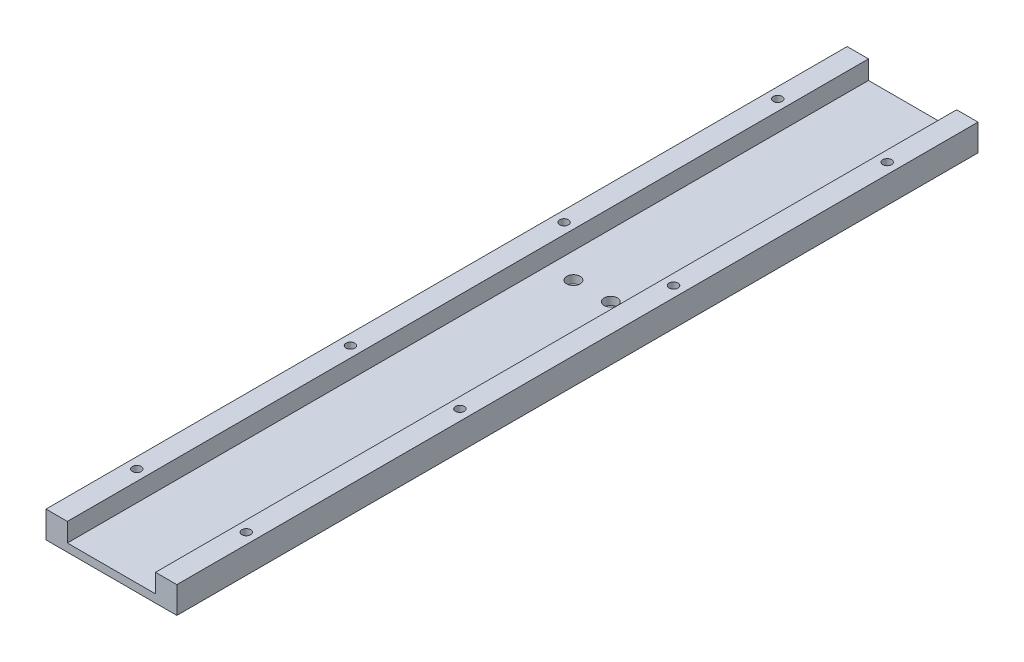
ISO-10303-21;
HEADER;
FILE_DESCRIPTION(('STEP AP214'),'2;1');
FILE_NAME('part.step','',(''),(''),'','','');
FILE_SCHEMA(('AUTOMOTIVE_DESIGN { 1 0 10303 214 1 1 1 1 }'));
ENDSEC;
DATA;
#1=APPLICATION_CONTEXT('core data for automotive mechanical design processes');
#2=APPLICATION_PROTOCOL_DEFINITION('international standard','automotive_design',2000,#1);
#3=PRODUCT_CONTEXT('',#1,'mechanical');
#4=PRODUCT('Part','Part','',(#3));
#5=PRODUCT_RELATED_PRODUCT_CATEGORY('part','',(#4));
#6=PRODUCT_DEFINITION_FORMATION('','',#4);
#7=PRODUCT_DEFINITION_CONTEXT('part definition',#1,'design');
#8=PRODUCT_DEFINITION('design','',#6,#7);
#9=PRODUCT_DEFINITION_SHAPE('','',#8);
#10=(LENGTH_UNIT() NAMED_UNIT(*) SI_UNIT(.MILLI.,.METRE.));
#11=(NAMED_UNIT(*) PLANE_ANGLE_UNIT() SI_UNIT($,.RADIAN.));
#12=(NAMED_UNIT(*) SI_UNIT($,.STERADIAN.) SOLID_ANGLE_UNIT());
#13=UNCERTAINTY_MEASURE_WITH_UNIT(LENGTH_MEASURE(1.E-05),#10,'distance_accuracy_value','');
#14=(GEOMETRIC_REPRESENTATION_CONTEXT(3) GLOBAL_UNCERTAINTY_ASSIGNED_CONTEXT((#13)) GLOBAL_UNIT_ASSIGNED_CONTEXT((#10,
#11,#12)) REPRESENTATION_CONTEXT('',''));
#15=CARTESIAN_POINT('',(0.,0.,0.));
#16=DIRECTION('',(0.,0.,1.));
#17=DIRECTION('',(1.,0.,0.));
#18=AXIS2_PLACEMENT_3D('',#15,#16,#17);
#19=CARTESIAN_POINT('',(0.,0.,300.));
#20=DIRECTION('',(0.,1.,0.));
#21=DIRECTION('',(0.,0.,1.));
#22=AXIS2_PLACEMENT_3D('',#19,#20,#21);
#23=PLANE('',#22);
#24=CARTESIAN_POINT('',(45.,0.,190.));
#25=DIRECTION('',(0.,1.,0.));
#26=DIRECTION('',(0.,0.,1.));
#27=AXIS2_PLACEMENT_3D('',#24,#25,#26);
#28=CIRCLE('',#27,1.65000000000001);
#29=CARTESIAN_POINT('',(45.,0.,191.65));
#30=VERTEX_POINT('',#29);
#31=EDGE_CURVE('E173',#30,#30,#28,.T.);
#32=ORIENTED_EDGE('',*,*,#31,.T.);
#33=EDGE_LOOP('',(#32));
#34=FACE_BOUND('',#33,.T.);
#35=CARTESIAN_POINT('',(45.,0.,110.));
#36=DIRECTION('',(0.,1.,0.));
#37=DIRECTION('',(0.,0.,-1.));
#38=AXIS2_PLACEMENT_3D('',#35,#36,#37);
#39=CIRCLE('',#38,1.65);
#40=CARTESIAN_POINT('',(45.,0.,108.35));
#41=VERTEX_POINT('',#40);
#42=EDGE_CURVE('E249',#41,#41,#39,.T.);
#43=ORIENTED_EDGE('',*,*,#42,.T.);
#44=EDGE_LOOP('',(#43));
#45=FACE_BOUND('',#44,.T.);
#46=CARTESIAN_POINT('',(44.9999999999999,0.,30.));
#47=DIRECTION('',(0.,1.,0.));
#48=DIRECTION('',(0.,0.,-1.));
#49=AXIS2_PLACEMENT_3D('',#46,#47,#48);
#50=CIRCLE('',#49,1.65);
#51=CARTESIAN_POINT('',(44.9999999999999,0.,28.35));
#52=VERTEX_POINT('',#51);
#53=EDGE_CURVE('E253',#52,#52,#50,.T.);
#54=ORIENTED_EDGE('',*,*,#53,.T.);
#55=EDGE_LOOP('',(#54));
#56=FACE_BOUND('',#55,.T.);
#57=CARTESIAN_POINT('',(3.99999999999993,0.,30.));
#58=DIRECTION('',(0.,1.,0.));
#59=DIRECTION('',(0.,0.,1.));
#60=AXIS2_PLACEMENT_3D('',#57,#58,#59);
#61=CIRCLE('',#60,1.65);
#62=CARTESIAN_POINT('',(3.99999999999993,0.,31.65));
#63=VERTEX_POINT('',#62);
#64=EDGE_CURVE('E257',#63,#63,#61,.T.);
#65=ORIENTED_EDGE('',*,*,#64,.T.);
#66=EDGE_LOOP('',(#65));
#67=FACE_BOUND('',#66,.T.);
#68=CARTESIAN_POINT('',(3.99999999999998,0.,110.));
#69=DIRECTION('',(0.,1.,0.));
#70=DIRECTION('',(0.,0.,1.));
#71=AXIS2_PLACEMENT_3D('',#68,#69,#70);
#72=CIRCLE('',#71,1.65);
#73=CARTESIAN_POINT('',(3.99999999999998,0.,111.65));
#74=VERTEX_POINT('',#73);
#75=EDGE_CURVE('E261',#74,#74,#72,.T.);
#76=ORIENTED_EDGE('',*,*,#75,.T.);
#77=EDGE_LOOP('',(#76));
#78=FACE_BOUND('',#77,.T.);
#79=CARTESIAN_POINT('',(4.,0.,190.));
#80=DIRECTION('',(0.,1.,0.));
#81=DIRECTION('',(0.,0.,-1.));
#82=AXIS2_PLACEMENT_3D('',#79,#80,#81);
#83=CIRCLE('',#82,1.65);
#84=CARTESIAN_POINT('',(4.,0.,188.35));
#85=VERTEX_POINT('',#84);
#86=EDGE_CURVE('E265',#85,#85,#83,.T.);
#87=ORIENTED_EDGE('',*,*,#86,.T.);
#88=EDGE_LOOP('',(#87));
#89=FACE_BOUND('',#88,.T.);
#90=CARTESIAN_POINT('',(4.,0.,270.));
#91=DIRECTION('',(0.,1.,0.));
#92=DIRECTION('',(0.,0.,-1.));
#93=AXIS2_PLACEMENT_3D('',#90,#91,#92);
#94=CIRCLE('',#93,1.65);
#95=CARTESIAN_POINT('',(4.,0.,268.35));
#96=VERTEX_POINT('',#95);
#97=EDGE_CURVE('E197',#96,#96,#94,.T.);
#98=ORIENTED_EDGE('',*,*,#97,.T.);
#99=EDGE_LOOP('',(#98));
#100=FACE_BOUND('',#99,.T.);
#101=CARTESIAN_POINT('',(45.,0.,270.));
#102=DIRECTION('',(0.,1.,0.));
#103=DIRECTION('',(0.,0.,1.));
#104=AXIS2_PLACEMENT_3D('',#101,#102,#103);
#105=CIRCLE('',#104,1.65000000000001);
#106=CARTESIAN_POINT('',(45.,0.,271.65));
#107=VERTEX_POINT('',#106);
#108=EDGE_CURVE('E168',#107,#107,#105,.T.);
#109=ORIENTED_EDGE('',*,*,#108,.T.);
#110=EDGE_LOOP('',(#109));
#111=FACE_BOUND('',#110,.T.);
#112=CARTESIAN_POINT('',(31.5,0.,120.));
#113=DIRECTION('',(0.,1.,0.));
#114=DIRECTION('',(0.,0.,-1.));
#115=AXIS2_PLACEMENT_3D('',#112,#113,#114);
#116=CIRCLE('',#115,2.5);
#117=CARTESIAN_POINT('',(31.5,0.,117.5));
#118=VERTEX_POINT('',#117);
#119=EDGE_CURVE('E164',#118,#118,#116,.T.);
#120=ORIENTED_EDGE('',*,*,#119,.T.);
#121=EDGE_LOOP('',(#120));
#122=FACE_BOUND('',#121,.T.);
#123=CARTESIAN_POINT('',(17.5,0.,120.));
#124=DIRECTION('',(0.,1.,0.));
#125=DIRECTION('',(0.,0.,1.));
#126=AXIS2_PLACEMENT_3D('',#123,#124,#125);
#127=CIRCLE('',#126,2.5);
#128=CARTESIAN_POINT('',(17.5,0.,122.5));
#129=VERTEX_POINT('',#128);
#130=EDGE_CURVE('E160',#129,#129,#127,.T.);
#131=ORIENTED_EDGE('',*,*,#130,.T.);
#132=EDGE_LOOP('',(#131));
#133=FACE_BOUND('',#132,.T.);
#134=DIRECTION('',(1.,0.,0.));
#135=VECTOR('',#134,1.);
#136=CARTESIAN_POINT('',(0.,0.,0.));
#137=LINE('',#136,#135);
#138=CARTESIAN_POINT('',(0.,0.,0.));
#139=VERTEX_POINT('',#138);
#140=CARTESIAN_POINT('',(49.,0.,0.));
#141=VERTEX_POINT('',#140);
#142=EDGE_CURVE('E131',#139,#141,#137,.T.);
#143=ORIENTED_EDGE('',*,*,#142,.T.);
#144=DIRECTION('',(0.,0.,-1.));
#145=VECTOR('',#144,1.);
#146=CARTESIAN_POINT('',(49.,0.,300.));
#147=LINE('',#146,#145);
#148=CARTESIAN_POINT('',(49.,0.,300.));
#149=VERTEX_POINT('',#148);
#150=EDGE_CURVE('E11',#149,#141,#147,.T.);
#151=ORIENTED_EDGE('',*,*,#150,.F.);
#152=DIRECTION('',(1.,0.,0.));
#153=VECTOR('',#152,1.);
#154=CARTESIAN_POINT('',(0.,0.,300.));
#155=LINE('',#154,#153);
#156=CARTESIAN_POINT('',(0.,0.,300.));
#157=VERTEX_POINT('',#156);
#158=EDGE_CURVE('E146',#157,#149,#155,.T.);
#159=ORIENTED_EDGE('',*,*,#158,.F.);
#160=DIRECTION('',(0.,0.,-1.));
#161=VECTOR('',#160,1.);
#162=CARTESIAN_POINT('',(0.,0.,300.));
#163=LINE('',#162,#161);
#164=EDGE_CURVE('E127',#157,#139,#163,.T.);
#165=ORIENTED_EDGE('',*,*,#164,.T.);
#166=EDGE_LOOP('',(#143,#151,#159,#165));
#167=FACE_BOUND('',#166,.T.);
#168=ADVANCED_FACE('F33',(#34,#45,#56,#67,#78,#89,#100,#111,#122,#133,#167),#23,.F.);
#169=CARTESIAN_POINT('',(49.,0.,300.));
#170=DIRECTION('',(-1.,0.,0.));
#171=DIRECTION('',(0.,0.,1.));
#172=AXIS2_PLACEMENT_3D('',#169,#170,#171);
#173=PLANE('',#172);
#174=DIRECTION('',(0.,1.,0.));
#175=VECTOR('',#174,1.);
#176=CARTESIAN_POINT('',(49.,0.,0.));
#177=LINE('',#176,#175);
#178=CARTESIAN_POINT('',(49.,10.,0.));
#179=VERTEX_POINT('',#178);
#180=EDGE_CURVE('E134',#141,#179,#177,.T.);
#181=ORIENTED_EDGE('',*,*,#180,.T.);
#182=DIRECTION('',(0.,0.,-1.));
#183=VECTOR('',#182,1.);
#184=CARTESIAN_POINT('',(49.,10.,300.));
#185=LINE('',#184,#183);
#186=CARTESIAN_POINT('',(49.,10.,300.));
#187=VERTEX_POINT('',#186);
#188=EDGE_CURVE('E42',#187,#179,#185,.T.);
#189=ORIENTED_EDGE('',*,*,#188,.F.);
#190=DIRECTION('',(0.,1.,0.));
#191=VECTOR('',#190,1.);
#192=CARTESIAN_POINT('',(49.,0.,300.));
#193=LINE('',#192,#191);
#194=EDGE_CURVE('E94',#149,#187,#193,.T.);
#195=ORIENTED_EDGE('',*,*,#194,.F.);
#196=ORIENTED_EDGE('',*,*,#150,.T.);
#197=EDGE_LOOP('',(#181,#189,#195,#196));
#198=FACE_BOUND('',#197,.T.);
#199=ADVANCED_FACE('F237',(#198),#173,.F.);
#200=CARTESIAN_POINT('',(49.,10.,300.));
#201=DIRECTION('',(0.,-1.,0.));
#202=DIRECTION('',(0.,0.,-1.));
#203=AXIS2_PLACEMENT_3D('',#200,#201,#202);
#204=PLANE('',#203);
#205=CARTESIAN_POINT('',(45.,10.,190.));
#206=DIRECTION('',(0.,-1.,0.));
#207=DIRECTION('',(0.,0.,-1.));
#208=AXIS2_PLACEMENT_3D('',#205,#206,#207);
#209=CIRCLE('',#208,1.65000000000001);
#210=CARTESIAN_POINT('',(45.,10.,188.35));
#211=VERTEX_POINT('',#210);
#212=EDGE_CURVE('E36',#211,#211,#209,.T.);
#213=ORIENTED_EDGE('',*,*,#212,.T.);
#214=EDGE_LOOP('',(#213));
#215=FACE_BOUND('',#214,.T.);
#216=CARTESIAN_POINT('',(45.,10.,110.));
#217=DIRECTION('',(0.,-1.,0.));
#218=DIRECTION('',(0.,0.,-1.));
#219=AXIS2_PLACEMENT_3D('',#216,#217,#218);
#220=CIRCLE('',#219,1.65);
#221=CARTESIAN_POINT('',(45.,10.,108.35));
#222=VERTEX_POINT('',#221);
#223=EDGE_CURVE('E184',#222,#222,#220,.T.);
#224=ORIENTED_EDGE('',*,*,#223,.T.);
#225=EDGE_LOOP('',(#224));
#226=FACE_BOUND('',#225,.T.);
#227=CARTESIAN_POINT('',(44.9999999999999,10.,30.));
#228=DIRECTION('',(0.,-1.,0.));
#229=DIRECTION('',(0.,0.,-1.));
#230=AXIS2_PLACEMENT_3D('',#227,#228,#229);
#231=CIRCLE('',#230,1.65);
#232=CARTESIAN_POINT('',(44.9999999999999,10.,28.35));
#233=VERTEX_POINT('',#232);
#234=EDGE_CURVE('E182',#233,#233,#231,.T.);
#235=ORIENTED_EDGE('',*,*,#234,.T.);
#236=EDGE_LOOP('',(#235));
#237=FACE_BOUND('',#236,.T.);
#238=CARTESIAN_POINT('',(45.,10.,270.));
#239=DIRECTION('',(0.,-1.,0.));
#240=DIRECTION('',(0.,0.,-1.));
#241=AXIS2_PLACEMENT_3D('',#238,#239,#240);
#242=CIRCLE('',#241,1.65000000000001);
#243=CARTESIAN_POINT('',(45.,10.,268.35));
#244=VERTEX_POINT('',#243);
#245=EDGE_CURVE('E165',#244,#244,#242,.T.);
#246=ORIENTED_EDGE('',*,*,#245,.T.);
#247=EDGE_LOOP('',(#246));
#248=FACE_BOUND('',#247,.T.);
#249=DIRECTION('',(-1.,0.,0.));
#250=VECTOR('',#249,1.);
#251=CARTESIAN_POINT('',(49.,10.,0.));
#252=LINE('',#251,#250);
#253=CARTESIAN_POINT('',(41.,10.,0.));
#254=VERTEX_POINT('',#253);
#255=EDGE_CURVE('E137',#179,#254,#252,.T.);
#256=ORIENTED_EDGE('',*,*,#255,.T.);
#257=DIRECTION('',(0.,0.,-1.));
#258=VECTOR('',#257,1.);
#259=CARTESIAN_POINT('',(41.,10.,300.));
#260=LINE('',#259,#258);
#261=CARTESIAN_POINT('',(41.,10.,300.));
#262=VERTEX_POINT('',#261);
#263=EDGE_CURVE('E153',#262,#254,#260,.T.);
#264=ORIENTED_EDGE('',*,*,#263,.F.);
#265=DIRECTION('',(-1.,0.,0.));
#266=VECTOR('',#265,1.);
#267=CARTESIAN_POINT('',(49.,10.,300.));
#268=LINE('',#267,#266);
#269=EDGE_CURVE('E205',#187,#262,#268,.T.);
#270=ORIENTED_EDGE('',*,*,#269,.F.);
#271=ORIENTED_EDGE('',*,*,#188,.T.);
#272=EDGE_LOOP('',(#256,#264,#270,#271));
#273=FACE_BOUND('',#272,.T.);
#274=ADVANCED_FACE('F242',(#215,#226,#237,#248,#273),#204,.F.);
#275=CARTESIAN_POINT('',(41.,10.,300.));
#276=DIRECTION('',(1.,0.,0.));
#277=DIRECTION('',(0.,0.,-1.));
#278=AXIS2_PLACEMENT_3D('',#275,#276,#277);
#279=PLANE('',#278);
#280=DIRECTION('',(0.,-1.,0.));
#281=VECTOR('',#280,1.);
#282=CARTESIAN_POINT('',(41.,10.,0.));
#283=LINE('',#282,#281);
#284=CARTESIAN_POINT('',(41.,3.,0.));
#285=VERTEX_POINT('',#284);
#286=EDGE_CURVE('E139',#254,#285,#283,.T.);
#287=ORIENTED_EDGE('',*,*,#286,.T.);
#288=DIRECTION('',(0.,0.,-1.));
#289=VECTOR('',#288,1.);
#290=CARTESIAN_POINT('',(41.,3.,300.));
#291=LINE('',#290,#289);
#292=CARTESIAN_POINT('',(41.,3.,300.));
#293=VERTEX_POINT('',#292);
#294=EDGE_CURVE('E150',#293,#285,#291,.T.);
#295=ORIENTED_EDGE('',*,*,#294,.F.);
#296=DIRECTION('',(0.,-1.,0.));
#297=VECTOR('',#296,1.);
#298=CARTESIAN_POINT('',(41.,10.,300.));
#299=LINE('',#298,#297);
#300=EDGE_CURVE('E207',#262,#293,#299,.T.);
#301=ORIENTED_EDGE('',*,*,#300,.F.);
#302=ORIENTED_EDGE('',*,*,#263,.T.);
#303=EDGE_LOOP('',(#287,#295,#301,#302));
#304=FACE_BOUND('',#303,.T.);
#305=ADVANCED_FACE('F213',(#304),#279,.F.);
#306=CARTESIAN_POINT('',(8.,3.,300.));
#307=DIRECTION('',(0.,-1.,0.));
#308=DIRECTION('',(0.,0.,-1.));
#309=AXIS2_PLACEMENT_3D('',#306,#307,#308);
#310=PLANE('',#309);
#311=CARTESIAN_POINT('',(31.5,3.,120.));
#312=DIRECTION('',(0.,-1.,0.));
#313=DIRECTION('',(0.,0.,-1.));
#314=AXIS2_PLACEMENT_3D('',#311,#312,#313);
#315=CIRCLE('',#314,2.5);
#316=CARTESIAN_POINT('',(31.5,3.,117.5));
#317=VERTEX_POINT('',#316);
#318=EDGE_CURVE('E161',#317,#317,#315,.T.);
#319=ORIENTED_EDGE('',*,*,#318,.T.);
#320=EDGE_LOOP('',(#319));
#321=FACE_BOUND('',#320,.T.);
#322=CARTESIAN_POINT('',(17.5,3.,120.));
#323=DIRECTION('',(0.,-1.,0.));
#324=DIRECTION('',(0.,0.,-1.));
#325=AXIS2_PLACEMENT_3D('',#322,#323,#324);
#326=CIRCLE('',#325,2.5);
#327=CARTESIAN_POINT('',(17.5,3.,117.5));
#328=VERTEX_POINT('',#327);
#329=EDGE_CURVE('E135',#328,#328,#326,.T.);
#330=ORIENTED_EDGE('',*,*,#329,.T.);
#331=EDGE_LOOP('',(#330));
#332=FACE_BOUND('',#331,.T.);
#333=DIRECTION('',(-1.,0.,0.));
#334=VECTOR('',#333,1.);
#335=CARTESIAN_POINT('',(8.,3.,0.));
#336=LINE('',#335,#334);
#337=CARTESIAN_POINT('',(8.,3.,0.));
#338=VERTEX_POINT('',#337);
#339=EDGE_CURVE('E141',#285,#338,#336,.T.);
#340=ORIENTED_EDGE('',*,*,#339,.T.);
#341=DIRECTION('',(0.,0.,-1.));
#342=VECTOR('',#341,1.);
#343=CARTESIAN_POINT('',(8.,3.,300.));
#344=LINE('',#343,#342);
#345=CARTESIAN_POINT('',(8.,3.,300.));
#346=VERTEX_POINT('',#345);
#347=EDGE_CURVE('E122',#346,#338,#344,.T.);
#348=ORIENTED_EDGE('',*,*,#347,.F.);
#349=DIRECTION('',(-1.,0.,0.));
#350=VECTOR('',#349,1.);
#351=CARTESIAN_POINT('',(8.,3.,300.));
#352=LINE('',#351,#350);
#353=EDGE_CURVE('E113',#293,#346,#352,.T.);
#354=ORIENTED_EDGE('',*,*,#353,.F.);
#355=ORIENTED_EDGE('',*,*,#294,.T.);
#356=EDGE_LOOP('',(#340,#348,#354,#355));
#357=FACE_BOUND('',#356,.T.);
#358=ADVANCED_FACE('F217',(#321,#332,#357),#310,.F.);
#359=CARTESIAN_POINT('',(8.,10.,300.));
#360=DIRECTION('',(-1.,0.,0.));
#361=DIRECTION('',(0.,0.,1.));
#362=AXIS2_PLACEMENT_3D('',#359,#360,#361);
#363=PLANE('',#362);
#364=DIRECTION('',(0.,1.,0.));
#365=VECTOR('',#364,1.);
#366=CARTESIAN_POINT('',(8.,10.,0.));
#367=LINE('',#366,#365);
#368=CARTESIAN_POINT('',(8.,10.,0.));
#369=VERTEX_POINT('',#368);
#370=EDGE_CURVE('E121',#338,#369,#367,.T.);
#371=ORIENTED_EDGE('',*,*,#370,.T.);
#372=DIRECTION('',(0.,0.,-1.));
#373=VECTOR('',#372,1.);
#374=CARTESIAN_POINT('',(8.,10.,300.));
#375=LINE('',#374,#373);
#376=CARTESIAN_POINT('',(8.,10.,300.));
#377=VERTEX_POINT('',#376);
#378=EDGE_CURVE('E118',#377,#369,#375,.T.);
#379=ORIENTED_EDGE('',*,*,#378,.F.);
#380=DIRECTION('',(0.,1.,0.));
#381=VECTOR('',#380,1.);
#382=CARTESIAN_POINT('',(8.,10.,300.));
#383=LINE('',#382,#381);
#384=EDGE_CURVE('E107',#346,#377,#383,.T.);
#385=ORIENTED_EDGE('',*,*,#384,.F.);
#386=ORIENTED_EDGE('',*,*,#347,.T.);
#387=EDGE_LOOP('',(#371,#379,#385,#386));
#388=FACE_BOUND('',#387,.T.);
#389=ADVANCED_FACE('F119',(#388),#363,.F.);
#390=CARTESIAN_POINT('',(0.,10.,300.));
#391=DIRECTION('',(0.,-1.,0.));
#392=DIRECTION('',(0.,0.,-1.));
#393=AXIS2_PLACEMENT_3D('',#390,#391,#392);
#394=PLANE('',#393);
#395=CARTESIAN_POINT('',(3.99999999999993,10.,30.));
#396=DIRECTION('',(0.,-1.,0.));
#397=DIRECTION('',(0.,0.,-1.));
#398=AXIS2_PLACEMENT_3D('',#395,#396,#397);
#399=CIRCLE('',#398,1.65);
#400=CARTESIAN_POINT('',(3.99999999999993,10.,28.35));
#401=VERTEX_POINT('',#400);
#402=EDGE_CURVE('E179',#401,#401,#399,.T.);
#403=ORIENTED_EDGE('',*,*,#402,.T.);
#404=EDGE_LOOP('',(#403));
#405=FACE_BOUND('',#404,.T.);
#406=CARTESIAN_POINT('',(3.99999999999998,10.,110.));
#407=DIRECTION('',(0.,-1.,0.));
#408=DIRECTION('',(0.,0.,-1.));
#409=AXIS2_PLACEMENT_3D('',#406,#407,#408);
#410=CIRCLE('',#409,1.65);
#411=CARTESIAN_POINT('',(3.99999999999998,10.,108.35));
#412=VERTEX_POINT('',#411);
#413=EDGE_CURVE('E176',#412,#412,#410,.T.);
#414=ORIENTED_EDGE('',*,*,#413,.T.);
#415=EDGE_LOOP('',(#414));
#416=FACE_BOUND('',#415,.T.);
#417=CARTESIAN_POINT('',(4.,10.,190.));
#418=DIRECTION('',(0.,-1.,0.));
#419=DIRECTION('',(0.,0.,-1.));
#420=AXIS2_PLACEMENT_3D('',#417,#418,#419);
#421=CIRCLE('',#420,1.65);
#422=CARTESIAN_POINT('',(4.,10.,188.35));
#423=VERTEX_POINT('',#422);
#424=EDGE_CURVE('E172',#423,#423,#421,.T.);
#425=ORIENTED_EDGE('',*,*,#424,.T.);
#426=EDGE_LOOP('',(#425));
#427=FACE_BOUND('',#426,.T.);
#428=CARTESIAN_POINT('',(4.,10.,270.));
#429=DIRECTION('',(0.,-1.,0.));
#430=DIRECTION('',(0.,0.,-1.));
#431=AXIS2_PLACEMENT_3D('',#428,#429,#430);
#432=CIRCLE('',#431,1.65);
#433=CARTESIAN_POINT('',(4.,10.,268.35));
#434=VERTEX_POINT('',#433);
#435=EDGE_CURVE('E169',#434,#434,#432,.T.);
#436=ORIENTED_EDGE('',*,*,#435,.T.);
#437=EDGE_LOOP('',(#436));
#438=FACE_BOUND('',#437,.T.);
#439=DIRECTION('',(-1.,0.,0.));
#440=VECTOR('',#439,1.);
#441=CARTESIAN_POINT('',(0.,10.,0.));
#442=LINE('',#441,#440);
#443=CARTESIAN_POINT('',(0.,10.,0.));
#444=VERTEX_POINT('',#443);
#445=EDGE_CURVE('E80',#369,#444,#442,.T.);
#446=ORIENTED_EDGE('',*,*,#445,.T.);
#447=DIRECTION('',(0.,0.,-1.));
#448=VECTOR('',#447,1.);
#449=CARTESIAN_POINT('',(0.,10.,300.));
#450=LINE('',#449,#448);
#451=CARTESIAN_POINT('',(0.,10.,300.));
#452=VERTEX_POINT('',#451);
#453=EDGE_CURVE('E123',#452,#444,#450,.T.);
#454=ORIENTED_EDGE('',*,*,#453,.F.);
#455=DIRECTION('',(-1.,0.,0.));
#456=VECTOR('',#455,1.);
#457=CARTESIAN_POINT('',(0.,10.,300.));
#458=LINE('',#457,#456);
#459=EDGE_CURVE('E111',#377,#452,#458,.T.);
#460=ORIENTED_EDGE('',*,*,#459,.F.);
#461=ORIENTED_EDGE('',*,*,#378,.T.);
#462=EDGE_LOOP('',(#446,#454,#460,#461));
#463=FACE_BOUND('',#462,.T.);
#464=ADVANCED_FACE('F125',(#405,#416,#427,#438,#463),#394,.F.);
#465=CARTESIAN_POINT('',(0.,0.,300.));
#466=DIRECTION('',(1.,0.,0.));
#467=DIRECTION('',(0.,0.,-1.));
#468=AXIS2_PLACEMENT_3D('',#465,#466,#467);
#469=PLANE('',#468);
#470=DIRECTION('',(0.,-1.,0.));
#471=VECTOR('',#470,1.);
#472=CARTESIAN_POINT('',(0.,0.,0.));
#473=LINE('',#472,#471);
#474=EDGE_CURVE('E86',#444,#139,#473,.T.);
#475=ORIENTED_EDGE('',*,*,#474,.T.);
#476=ORIENTED_EDGE('',*,*,#164,.F.);
#477=DIRECTION('',(0.,-1.,0.));
#478=VECTOR('',#477,1.);
#479=CARTESIAN_POINT('',(0.,0.,300.));
#480=LINE('',#479,#478);
#481=EDGE_CURVE('E51',#452,#157,#480,.T.);
#482=ORIENTED_EDGE('',*,*,#481,.F.);
#483=ORIENTED_EDGE('',*,*,#453,.T.);
#484=EDGE_LOOP('',(#475,#476,#482,#483));
#485=FACE_BOUND('',#484,.T.);
#486=ADVANCED_FACE('F225',(#485),#469,.F.);
#487=CARTESIAN_POINT('',(0.,0.,300.));
#488=DIRECTION('',(0.,0.,1.));
#489=DIRECTION('',(1.,0.,0.));
#490=AXIS2_PLACEMENT_3D('',#487,#488,#489);
#491=PLANE('',#490);
#492=ORIENTED_EDGE('',*,*,#158,.T.);
#493=ORIENTED_EDGE('',*,*,#194,.T.);
#494=ORIENTED_EDGE('',*,*,#269,.T.);
#495=ORIENTED_EDGE('',*,*,#300,.T.);
#496=ORIENTED_EDGE('',*,*,#353,.T.);
#497=ORIENTED_EDGE('',*,*,#384,.T.);
#498=ORIENTED_EDGE('',*,*,#459,.T.);
#499=ORIENTED_EDGE('',*,*,#481,.T.);
#500=EDGE_LOOP('',(#492,#493,#494,#495,#496,#497,#498,#499));
#501=FACE_BOUND('',#500,.T.);
#502=ADVANCED_FACE('F109',(#501),#491,.T.);
#503=CARTESIAN_POINT('',(0.,0.,0.));
#504=DIRECTION('',(0.,0.,1.));
#505=DIRECTION('',(1.,0.,0.));
#506=AXIS2_PLACEMENT_3D('',#503,#504,#505);
#507=PLANE('',#506);
#508=ORIENTED_EDGE('',*,*,#142,.F.);
#509=ORIENTED_EDGE('',*,*,#474,.F.);
#510=ORIENTED_EDGE('',*,*,#445,.F.);
#511=ORIENTED_EDGE('',*,*,#370,.F.);
#512=ORIENTED_EDGE('',*,*,#339,.F.);
#513=ORIENTED_EDGE('',*,*,#286,.F.);
#514=ORIENTED_EDGE('',*,*,#255,.F.);
#515=ORIENTED_EDGE('',*,*,#180,.F.);
#516=EDGE_LOOP('',(#508,#509,#510,#511,#512,#513,#514,#515));
#517=FACE_BOUND('',#516,.T.);
#518=ADVANCED_FACE('F220',(#517),#507,.F.);
#519=CARTESIAN_POINT('',(17.5,0.,120.));
#520=DIRECTION('',(0.,1.,0.));
#521=DIRECTION('',(0.,0.,1.));
#522=AXIS2_PLACEMENT_3D('',#519,#520,#521);
#523=CYLINDRICAL_SURFACE('',#522,2.5);
#524=ORIENTED_EDGE('',*,*,#130,.F.);
#525=EDGE_LOOP('',(#524));
#526=FACE_BOUND('',#525,.T.);
#527=ORIENTED_EDGE('',*,*,#329,.F.);
#528=EDGE_LOOP('',(#527));
#529=FACE_BOUND('',#528,.T.);
#530=ADVANCED_FACE('F273',(#526,#529),#523,.F.);
#531=CARTESIAN_POINT('',(31.5,0.,120.));
#532=DIRECTION('',(0.,1.,0.));
#533=DIRECTION('',(0.,0.,1.));
#534=AXIS2_PLACEMENT_3D('',#531,#532,#533);
#535=CYLINDRICAL_SURFACE('',#534,2.5);
#536=ORIENTED_EDGE('',*,*,#119,.F.);
#537=EDGE_LOOP('',(#536));
#538=FACE_BOUND('',#537,.T.);
#539=ORIENTED_EDGE('',*,*,#318,.F.);
#540=EDGE_LOOP('',(#539));
#541=FACE_BOUND('',#540,.T.);
#542=ADVANCED_FACE('F276',(#538,#541),#535,.F.);
#543=CARTESIAN_POINT('',(45.,0.,270.));
#544=DIRECTION('',(0.,1.,0.));
#545=DIRECTION('',(0.,0.,1.));
#546=AXIS2_PLACEMENT_3D('',#543,#544,#545);
#547=CYLINDRICAL_SURFACE('',#546,1.65000000000001);
#548=ORIENTED_EDGE('',*,*,#108,.F.);
#549=EDGE_LOOP('',(#548));
#550=FACE_BOUND('',#549,.T.);
#551=ORIENTED_EDGE('',*,*,#245,.F.);
#552=EDGE_LOOP('',(#551));
#553=FACE_BOUND('',#552,.T.);
#554=ADVANCED_FACE('F299',(#550,#553),#547,.F.);
#555=CARTESIAN_POINT('',(4.,0.,270.));
#556=DIRECTION('',(0.,1.,0.));
#557=DIRECTION('',(0.,0.,1.));
#558=AXIS2_PLACEMENT_3D('',#555,#556,#557);
#559=CYLINDRICAL_SURFACE('',#558,1.65);
#560=ORIENTED_EDGE('',*,*,#97,.F.);
#561=EDGE_LOOP('',(#560));
#562=FACE_BOUND('',#561,.T.);
#563=ORIENTED_EDGE('',*,*,#435,.F.);
#564=EDGE_LOOP('',(#563));
#565=FACE_BOUND('',#564,.T.);
#566=ADVANCED_FACE('F301',(#562,#565),#559,.F.);
#567=CARTESIAN_POINT('',(4.,0.,190.));
#568=DIRECTION('',(0.,1.,0.));
#569=DIRECTION('',(0.,0.,1.));
#570=AXIS2_PLACEMENT_3D('',#567,#568,#569);
#571=CYLINDRICAL_SURFACE('',#570,1.65);
#572=ORIENTED_EDGE('',*,*,#86,.F.);
#573=EDGE_LOOP('',(#572));
#574=FACE_BOUND('',#573,.T.);
#575=ORIENTED_EDGE('',*,*,#424,.F.);
#576=EDGE_LOOP('',(#575));
#577=FACE_BOUND('',#576,.T.);
#578=ADVANCED_FACE('F308',(#574,#577),#571,.F.);
#579=CARTESIAN_POINT('',(3.99999999999998,0.,110.));
#580=DIRECTION('',(0.,1.,0.));
#581=DIRECTION('',(0.,0.,1.));
#582=AXIS2_PLACEMENT_3D('',#579,#580,#581);
#583=CYLINDRICAL_SURFACE('',#582,1.65);
#584=ORIENTED_EDGE('',*,*,#75,.F.);
#585=EDGE_LOOP('',(#584));
#586=FACE_BOUND('',#585,.T.);
#587=ORIENTED_EDGE('',*,*,#413,.F.);
#588=EDGE_LOOP('',(#587));
#589=FACE_BOUND('',#588,.T.);
#590=ADVANCED_FACE('F364',(#586,#589),#583,.F.);
#591=CARTESIAN_POINT('',(3.99999999999993,0.,30.));
#592=DIRECTION('',(0.,1.,0.));
#593=DIRECTION('',(0.,0.,1.));
#594=AXIS2_PLACEMENT_3D('',#591,#592,#593);
#595=CYLINDRICAL_SURFACE('',#594,1.65);
#596=ORIENTED_EDGE('',*,*,#64,.F.);
#597=EDGE_LOOP('',(#596));
#598=FACE_BOUND('',#597,.T.);
#599=ORIENTED_EDGE('',*,*,#402,.F.);
#600=EDGE_LOOP('',(#599));
#601=FACE_BOUND('',#600,.T.);
#602=ADVANCED_FACE('F373',(#598,#601),#595,.F.);
#603=CARTESIAN_POINT('',(44.9999999999999,0.,30.));
#604=DIRECTION('',(0.,1.,0.));
#605=DIRECTION('',(0.,0.,1.));
#606=AXIS2_PLACEMENT_3D('',#603,#604,#605);
#607=CYLINDRICAL_SURFACE('',#606,1.65);
#608=ORIENTED_EDGE('',*,*,#53,.F.);
#609=EDGE_LOOP('',(#608));
#610=FACE_BOUND('',#609,.T.);
#611=ORIENTED_EDGE('',*,*,#234,.F.);
#612=EDGE_LOOP('',(#611));
#613=FACE_BOUND('',#612,.T.);
#614=ADVANCED_FACE('F383',(#610,#613),#607,.F.);
#615=CARTESIAN_POINT('',(45.,0.,110.));
#616=DIRECTION('',(0.,1.,0.));
#617=DIRECTION('',(0.,0.,1.));
#618=AXIS2_PLACEMENT_3D('',#615,#616,#617);
#619=CYLINDRICAL_SURFACE('',#618,1.65);
#620=ORIENTED_EDGE('',*,*,#42,.F.);
#621=EDGE_LOOP('',(#620));
#622=FACE_BOUND('',#621,.T.);
#623=ORIENTED_EDGE('',*,*,#223,.F.);
#624=EDGE_LOOP('',(#623));
#625=FACE_BOUND('',#624,.T.);
#626=ADVANCED_FACE('F393',(#622,#625),#619,.F.);
#627=CARTESIAN_POINT('',(45.,0.,190.));
#628=DIRECTION('',(0.,1.,0.));
#629=DIRECTION('',(0.,0.,1.));
#630=AXIS2_PLACEMENT_3D('',#627,#628,#629);
#631=CYLINDRICAL_SURFACE('',#630,1.65000000000001);
#632=ORIENTED_EDGE('',*,*,#31,.F.);
#633=EDGE_LOOP('',(#632));
#634=FACE_BOUND('',#633,.T.);
#635=ORIENTED_EDGE('',*,*,#212,.F.);
#636=EDGE_LOOP('',(#635));
#637=FACE_BOUND('',#636,.T.);
#638=ADVANCED_FACE('F403',(#634,#637),#631,.F.);
#639=CLOSED_SHELL('',(#168,#199,#274,#305,#358,#389,#464,#486,#502,#518,#530,#542,#554,#566,
#578,#590,#602,#614,#626,#638));
#640=MANIFOLD_SOLID_BREP('B2',#639);
#641=ADVANCED_BREP_SHAPE_REPRESENTATION('',(#18,#640),#14);
#642=SHAPE_DEFINITION_REPRESENTATION(#9,#641);
ENDSEC;
END-ISO-10303-21;
